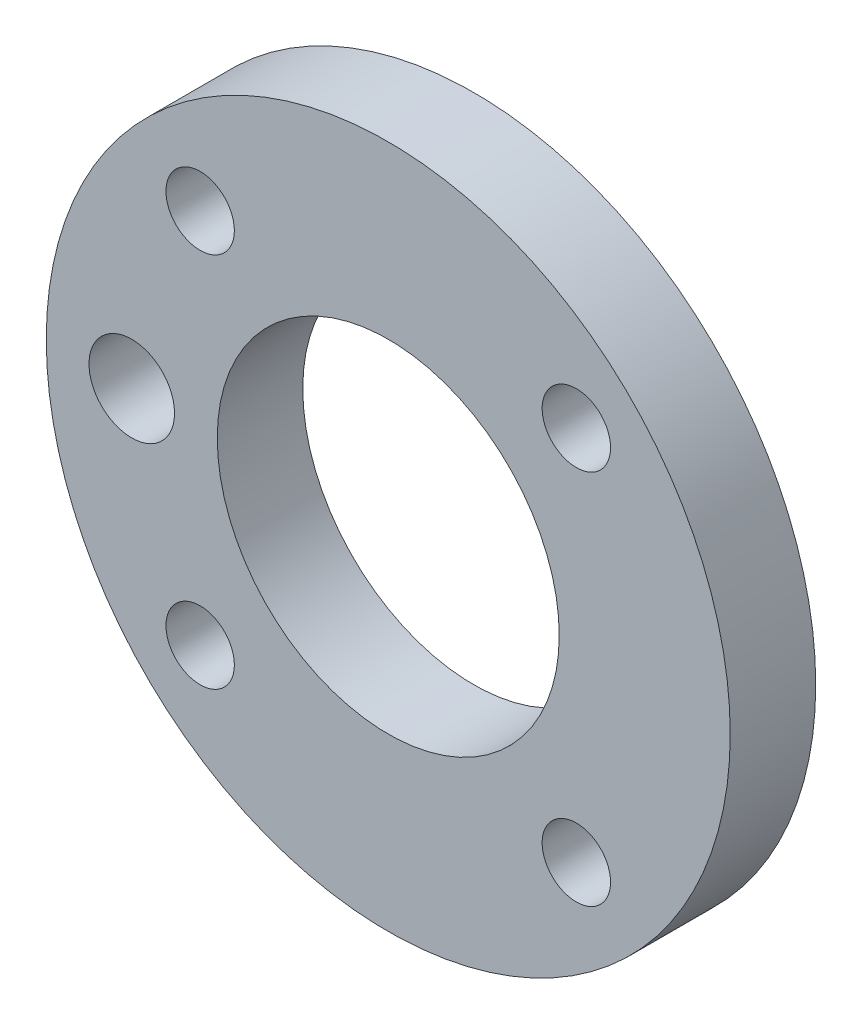
ISO-10303-21;
HEADER;
FILE_DESCRIPTION(('STEP AP214'),'2;1');
FILE_NAME('part.step','',(''),(''),'','','');
FILE_SCHEMA(('AUTOMOTIVE_DESIGN { 1 0 10303 214 1 1 1 1 }'));
ENDSEC;
DATA;
#1=APPLICATION_CONTEXT('core data for automotive mechanical design processes');
#2=APPLICATION_PROTOCOL_DEFINITION('international standard','automotive_design',2000,#1);
#3=PRODUCT_CONTEXT('',#1,'mechanical');
#4=PRODUCT('Part','Part','',(#3));
#5=PRODUCT_RELATED_PRODUCT_CATEGORY('part','',(#4));
#6=PRODUCT_DEFINITION_FORMATION('','',#4);
#7=PRODUCT_DEFINITION_CONTEXT('part definition',#1,'design');
#8=PRODUCT_DEFINITION('design','',#6,#7);
#9=PRODUCT_DEFINITION_SHAPE('','',#8);
#10=(LENGTH_UNIT() NAMED_UNIT(*) SI_UNIT(.MILLI.,.METRE.));
#11=(NAMED_UNIT(*) PLANE_ANGLE_UNIT() SI_UNIT($,.RADIAN.));
#12=(NAMED_UNIT(*) SI_UNIT($,.STERADIAN.) SOLID_ANGLE_UNIT());
#13=UNCERTAINTY_MEASURE_WITH_UNIT(LENGTH_MEASURE(1.E-05),#10,'distance_accuracy_value','');
#14=(GEOMETRIC_REPRESENTATION_CONTEXT(3) GLOBAL_UNCERTAINTY_ASSIGNED_CONTEXT((#13)) GLOBAL_UNIT_ASSIGNED_CONTEXT((#10,
#11,#12)) REPRESENTATION_CONTEXT('',''));
#15=CARTESIAN_POINT('',(0.,0.,0.));
#16=DIRECTION('',(0.,0.,1.));
#17=DIRECTION('',(1.,0.,0.));
#18=AXIS2_PLACEMENT_3D('',#15,#16,#17);
#19=CARTESIAN_POINT('',(0.,0.,5.));
#20=DIRECTION('',(0.,0.,1.));
#21=DIRECTION('',(1.,0.,0.));
#22=AXIS2_PLACEMENT_3D('',#19,#20,#21);
#23=PLANE('',#22);
#24=CARTESIAN_POINT('',(11.0000000000002,-11.,5.));
#25=DIRECTION('',(0.,0.,1.));
#26=DIRECTION('',(1.,0.,0.));
#27=AXIS2_PLACEMENT_3D('',#24,#25,#26);
#28=CIRCLE('',#27,2.);
#29=CARTESIAN_POINT('',(13.0000000000002,-11.,5.));
#30=VERTEX_POINT('',#29);
#31=EDGE_CURVE('E65',#30,#30,#28,.T.);
#32=ORIENTED_EDGE('',*,*,#31,.F.);
#33=EDGE_LOOP('',(#32));
#34=FACE_BOUND('',#33,.T.);
#35=CARTESIAN_POINT('',(-15.,0.,5.));
#36=DIRECTION('',(0.,0.,1.));
#37=DIRECTION('',(1.,0.,0.));
#38=AXIS2_PLACEMENT_3D('',#35,#36,#37);
#39=CIRCLE('',#38,2.5);
#40=CARTESIAN_POINT('',(-12.5,0.,5.));
#41=VERTEX_POINT('',#40);
#42=EDGE_CURVE('E53',#41,#41,#39,.T.);
#43=ORIENTED_EDGE('',*,*,#42,.F.);
#44=EDGE_LOOP('',(#43));
#45=FACE_BOUND('',#44,.T.);
#46=CARTESIAN_POINT('',(0.,0.,5.));
#47=DIRECTION('',(0.,0.,1.));
#48=DIRECTION('',(1.,0.,0.));
#49=AXIS2_PLACEMENT_3D('',#46,#47,#48);
#50=CIRCLE('',#49,10.);
#51=CARTESIAN_POINT('',(10.,0.,5.));
#52=VERTEX_POINT('',#51);
#53=EDGE_CURVE('E42',#52,#52,#50,.T.);
#54=ORIENTED_EDGE('',*,*,#53,.F.);
#55=EDGE_LOOP('',(#54));
#56=FACE_BOUND('',#55,.T.);
#57=CARTESIAN_POINT('',(0.,0.,5.));
#58=DIRECTION('',(0.,0.,1.));
#59=DIRECTION('',(1.,0.,0.));
#60=AXIS2_PLACEMENT_3D('',#57,#58,#59);
#61=CIRCLE('',#60,20.);
#62=CARTESIAN_POINT('',(20.,0.,5.));
#63=VERTEX_POINT('',#62);
#64=EDGE_CURVE('E10',#63,#63,#61,.T.);
#65=ORIENTED_EDGE('',*,*,#64,.T.);
#66=EDGE_LOOP('',(#65));
#67=FACE_BOUND('',#66,.T.);
#68=CARTESIAN_POINT('',(-11.,11.,5.));
#69=DIRECTION('',(0.,0.,1.));
#70=DIRECTION('',(1.,0.,0.));
#71=AXIS2_PLACEMENT_3D('',#68,#69,#70);
#72=CIRCLE('',#71,2.);
#73=CARTESIAN_POINT('',(-9.00000000000001,11.,5.));
#74=VERTEX_POINT('',#73);
#75=EDGE_CURVE('E47',#74,#74,#72,.T.);
#76=ORIENTED_EDGE('',*,*,#75,.F.);
#77=EDGE_LOOP('',(#76));
#78=FACE_BOUND('',#77,.T.);
#79=CARTESIAN_POINT('',(11.,11.,5.));
#80=DIRECTION('',(0.,0.,1.));
#81=DIRECTION('',(1.,0.,0.));
#82=AXIS2_PLACEMENT_3D('',#79,#80,#81);
#83=CIRCLE('',#82,2.);
#84=CARTESIAN_POINT('',(13.,11.,5.));
#85=VERTEX_POINT('',#84);
#86=EDGE_CURVE('E59',#85,#85,#83,.T.);
#87=ORIENTED_EDGE('',*,*,#86,.F.);
#88=EDGE_LOOP('',(#87));
#89=FACE_BOUND('',#88,.T.);
#90=CARTESIAN_POINT('',(-10.9999999999998,-11.,5.));
#91=DIRECTION('',(0.,0.,1.));
#92=DIRECTION('',(1.,0.,0.));
#93=AXIS2_PLACEMENT_3D('',#90,#91,#92);
#94=CIRCLE('',#93,2.);
#95=CARTESIAN_POINT('',(-8.99999999999978,-11.,5.));
#96=VERTEX_POINT('',#95);
#97=EDGE_CURVE('E71',#96,#96,#94,.T.);
#98=ORIENTED_EDGE('',*,*,#97,.F.);
#99=EDGE_LOOP('',(#98));
#100=FACE_BOUND('',#99,.T.);
#101=ADVANCED_FACE('F31',(#34,#45,#56,#67,#78,#89,#100),#23,.T.);
#102=CARTESIAN_POINT('',(0.,0.,0.));
#103=DIRECTION('',(0.,0.,1.));
#104=DIRECTION('',(1.,0.,0.));
#105=AXIS2_PLACEMENT_3D('',#102,#103,#104);
#106=PLANE('',#105);
#107=CARTESIAN_POINT('',(0.,0.,0.));
#108=DIRECTION('',(0.,0.,1.));
#109=DIRECTION('',(1.,0.,0.));
#110=AXIS2_PLACEMENT_3D('',#107,#108,#109);
#111=CIRCLE('',#110,20.);
#112=CARTESIAN_POINT('',(20.,0.,0.));
#113=VERTEX_POINT('',#112);
#114=EDGE_CURVE('E35',#113,#113,#111,.T.);
#115=ORIENTED_EDGE('',*,*,#114,.F.);
#116=EDGE_LOOP('',(#115));
#117=FACE_BOUND('',#116,.T.);
#118=CARTESIAN_POINT('',(0.,0.,0.));
#119=DIRECTION('',(0.,0.,1.));
#120=DIRECTION('',(1.,0.,0.));
#121=AXIS2_PLACEMENT_3D('',#118,#119,#120);
#122=CIRCLE('',#121,10.);
#123=CARTESIAN_POINT('',(10.,0.,0.));
#124=VERTEX_POINT('',#123);
#125=EDGE_CURVE('E44',#124,#124,#122,.T.);
#126=ORIENTED_EDGE('',*,*,#125,.T.);
#127=EDGE_LOOP('',(#126));
#128=FACE_BOUND('',#127,.T.);
#129=CARTESIAN_POINT('',(-11.,11.,0.));
#130=DIRECTION('',(0.,0.,1.));
#131=DIRECTION('',(1.,0.,0.));
#132=AXIS2_PLACEMENT_3D('',#129,#130,#131);
#133=CIRCLE('',#132,2.);
#134=CARTESIAN_POINT('',(-9.00000000000001,11.,0.));
#135=VERTEX_POINT('',#134);
#136=EDGE_CURVE('E50',#135,#135,#133,.T.);
#137=ORIENTED_EDGE('',*,*,#136,.T.);
#138=EDGE_LOOP('',(#137));
#139=FACE_BOUND('',#138,.T.);
#140=CARTESIAN_POINT('',(-15.,0.,0.));
#141=DIRECTION('',(0.,0.,1.));
#142=DIRECTION('',(1.,0.,0.));
#143=AXIS2_PLACEMENT_3D('',#140,#141,#142);
#144=CIRCLE('',#143,2.5);
#145=CARTESIAN_POINT('',(-12.5,0.,0.));
#146=VERTEX_POINT('',#145);
#147=EDGE_CURVE('E56',#146,#146,#144,.T.);
#148=ORIENTED_EDGE('',*,*,#147,.T.);
#149=EDGE_LOOP('',(#148));
#150=FACE_BOUND('',#149,.T.);
#151=CARTESIAN_POINT('',(11.,11.,0.));
#152=DIRECTION('',(0.,0.,1.));
#153=DIRECTION('',(1.,0.,0.));
#154=AXIS2_PLACEMENT_3D('',#151,#152,#153);
#155=CIRCLE('',#154,2.);
#156=CARTESIAN_POINT('',(13.,11.,0.));
#157=VERTEX_POINT('',#156);
#158=EDGE_CURVE('E62',#157,#157,#155,.T.);
#159=ORIENTED_EDGE('',*,*,#158,.T.);
#160=EDGE_LOOP('',(#159));
#161=FACE_BOUND('',#160,.T.);
#162=CARTESIAN_POINT('',(11.0000000000002,-11.,0.));
#163=DIRECTION('',(0.,0.,1.));
#164=DIRECTION('',(1.,0.,0.));
#165=AXIS2_PLACEMENT_3D('',#162,#163,#164);
#166=CIRCLE('',#165,2.);
#167=CARTESIAN_POINT('',(13.0000000000002,-11.,0.));
#168=VERTEX_POINT('',#167);
#169=EDGE_CURVE('E68',#168,#168,#166,.T.);
#170=ORIENTED_EDGE('',*,*,#169,.T.);
#171=EDGE_LOOP('',(#170));
#172=FACE_BOUND('',#171,.T.);
#173=CARTESIAN_POINT('',(-10.9999999999998,-11.,0.));
#174=DIRECTION('',(0.,0.,1.));
#175=DIRECTION('',(1.,0.,0.));
#176=AXIS2_PLACEMENT_3D('',#173,#174,#175);
#177=CIRCLE('',#176,2.);
#178=CARTESIAN_POINT('',(-8.99999999999978,-11.,0.));
#179=VERTEX_POINT('',#178);
#180=EDGE_CURVE('E74',#179,#179,#177,.T.);
#181=ORIENTED_EDGE('',*,*,#180,.T.);
#182=EDGE_LOOP('',(#181));
#183=FACE_BOUND('',#182,.T.);
#184=ADVANCED_FACE('F84',(#117,#128,#139,#150,#161,#172,#183),#106,.F.);
#185=CARTESIAN_POINT('',(0.,0.,5.));
#186=DIRECTION('',(0.,0.,-1.));
#187=DIRECTION('',(-1.,0.,0.));
#188=AXIS2_PLACEMENT_3D('',#185,#186,#187);
#189=CYLINDRICAL_SURFACE('',#188,20.);
#190=ORIENTED_EDGE('',*,*,#64,.F.);
#191=EDGE_LOOP('',(#190));
#192=FACE_BOUND('',#191,.T.);
#193=ORIENTED_EDGE('',*,*,#114,.T.);
#194=EDGE_LOOP('',(#193));
#195=FACE_BOUND('',#194,.T.);
#196=ADVANCED_FACE('F33',(#192,#195),#189,.T.);
#197=CARTESIAN_POINT('',(0.,0.,5.));
#198=DIRECTION('',(0.,0.,-1.));
#199=DIRECTION('',(-1.,0.,0.));
#200=AXIS2_PLACEMENT_3D('',#197,#198,#199);
#201=CYLINDRICAL_SURFACE('',#200,10.);
#202=ORIENTED_EDGE('',*,*,#53,.T.);
#203=EDGE_LOOP('',(#202));
#204=FACE_BOUND('',#203,.T.);
#205=ORIENTED_EDGE('',*,*,#125,.F.);
#206=EDGE_LOOP('',(#205));
#207=FACE_BOUND('',#206,.T.);
#208=ADVANCED_FACE('F94',(#204,#207),#201,.F.);
#209=CARTESIAN_POINT('',(-11.,11.,5.));
#210=DIRECTION('',(0.,0.,-1.));
#211=DIRECTION('',(-1.,0.,0.));
#212=AXIS2_PLACEMENT_3D('',#209,#210,#211);
#213=CYLINDRICAL_SURFACE('',#212,2.);
#214=ORIENTED_EDGE('',*,*,#75,.T.);
#215=EDGE_LOOP('',(#214));
#216=FACE_BOUND('',#215,.T.);
#217=ORIENTED_EDGE('',*,*,#136,.F.);
#218=EDGE_LOOP('',(#217));
#219=FACE_BOUND('',#218,.T.);
#220=ADVANCED_FACE('F97',(#216,#219),#213,.F.);
#221=CARTESIAN_POINT('',(-15.,0.,5.));
#222=DIRECTION('',(0.,0.,-1.));
#223=DIRECTION('',(-1.,0.,0.));
#224=AXIS2_PLACEMENT_3D('',#221,#222,#223);
#225=CYLINDRICAL_SURFACE('',#224,2.5);
#226=ORIENTED_EDGE('',*,*,#42,.T.);
#227=EDGE_LOOP('',(#226));
#228=FACE_BOUND('',#227,.T.);
#229=ORIENTED_EDGE('',*,*,#147,.F.);
#230=EDGE_LOOP('',(#229));
#231=FACE_BOUND('',#230,.T.);
#232=ADVANCED_FACE('F101',(#228,#231),#225,.F.);
#233=CARTESIAN_POINT('',(11.,11.,5.));
#234=DIRECTION('',(0.,0.,-1.));
#235=DIRECTION('',(-1.,0.,0.));
#236=AXIS2_PLACEMENT_3D('',#233,#234,#235);
#237=CYLINDRICAL_SURFACE('',#236,2.);
#238=ORIENTED_EDGE('',*,*,#86,.T.);
#239=EDGE_LOOP('',(#238));
#240=FACE_BOUND('',#239,.T.);
#241=ORIENTED_EDGE('',*,*,#158,.F.);
#242=EDGE_LOOP('',(#241));
#243=FACE_BOUND('',#242,.T.);
#244=ADVANCED_FACE('F105',(#240,#243),#237,.F.);
#245=CARTESIAN_POINT('',(11.0000000000002,-11.,5.));
#246=DIRECTION('',(0.,0.,-1.));
#247=DIRECTION('',(-1.,0.,0.));
#248=AXIS2_PLACEMENT_3D('',#245,#246,#247);
#249=CYLINDRICAL_SURFACE('',#248,2.);
#250=ORIENTED_EDGE('',*,*,#31,.T.);
#251=EDGE_LOOP('',(#250));
#252=FACE_BOUND('',#251,.T.);
#253=ORIENTED_EDGE('',*,*,#169,.F.);
#254=EDGE_LOOP('',(#253));
#255=FACE_BOUND('',#254,.T.);
#256=ADVANCED_FACE('F109',(#252,#255),#249,.F.);
#257=CARTESIAN_POINT('',(-10.9999999999998,-11.,5.));
#258=DIRECTION('',(0.,0.,-1.));
#259=DIRECTION('',(-1.,0.,0.));
#260=AXIS2_PLACEMENT_3D('',#257,#258,#259);
#261=CYLINDRICAL_SURFACE('',#260,2.);
#262=ORIENTED_EDGE('',*,*,#97,.T.);
#263=EDGE_LOOP('',(#262));
#264=FACE_BOUND('',#263,.T.);
#265=ORIENTED_EDGE('',*,*,#180,.F.);
#266=EDGE_LOOP('',(#265));
#267=FACE_BOUND('',#266,.T.);
#268=ADVANCED_FACE('F80',(#264,#267),#261,.F.);
#269=CLOSED_SHELL('',(#101,#184,#196,#208,#220,#232,#244,#256,#268));
#270=MANIFOLD_SOLID_BREP('B2',#269);
#271=ADVANCED_BREP_SHAPE_REPRESENTATION('',(#18,#270),#14);
#272=SHAPE_DEFINITION_REPRESENTATION(#9,#271);
ENDSEC;
END-ISO-10303-21;
